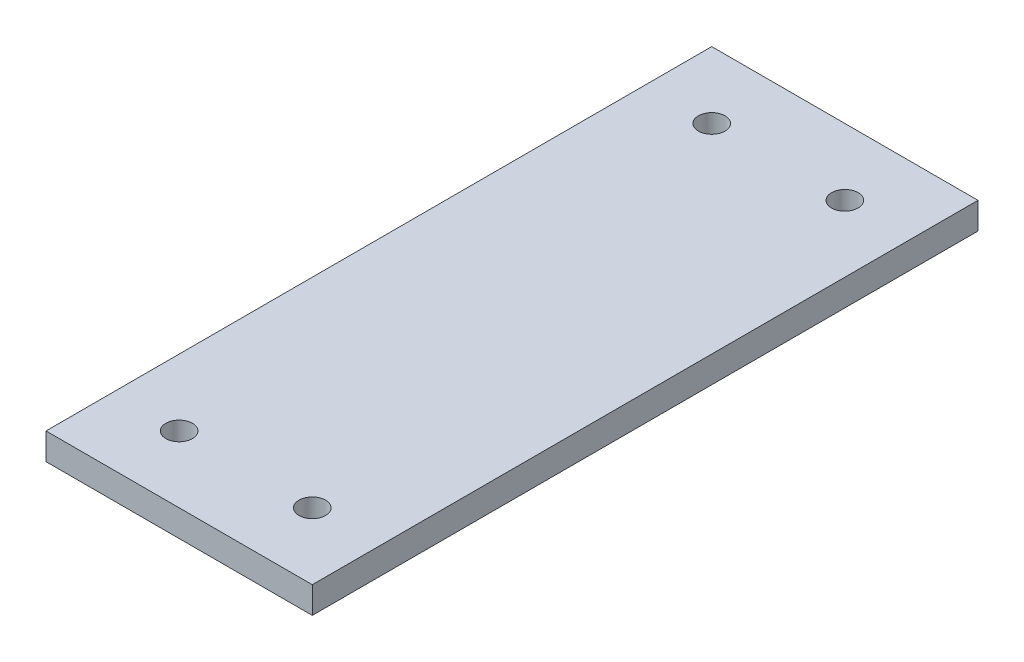
ISO-10303-21;
HEADER;
FILE_DESCRIPTION(('STEP AP214'),'2;1');
FILE_NAME('part.step','',(''),(''),'','','');
FILE_SCHEMA(('AUTOMOTIVE_DESIGN { 1 0 10303 214 1 1 1 1 }'));
ENDSEC;
DATA;
#1=APPLICATION_CONTEXT('core data for automotive mechanical design processes');
#2=APPLICATION_PROTOCOL_DEFINITION('international standard','automotive_design',2000,#1);
#3=PRODUCT_CONTEXT('',#1,'mechanical');
#4=PRODUCT('Part','Part','',(#3));
#5=PRODUCT_RELATED_PRODUCT_CATEGORY('part','',(#4));
#6=PRODUCT_DEFINITION_FORMATION('','',#4);
#7=PRODUCT_DEFINITION_CONTEXT('part definition',#1,'design');
#8=PRODUCT_DEFINITION('design','',#6,#7);
#9=PRODUCT_DEFINITION_SHAPE('','',#8);
#10=(LENGTH_UNIT() NAMED_UNIT(*) SI_UNIT(.MILLI.,.METRE.));
#11=(NAMED_UNIT(*) PLANE_ANGLE_UNIT() SI_UNIT($,.RADIAN.));
#12=(NAMED_UNIT(*) SI_UNIT($,.STERADIAN.) SOLID_ANGLE_UNIT());
#13=UNCERTAINTY_MEASURE_WITH_UNIT(LENGTH_MEASURE(1.E-05),#10,'distance_accuracy_value','');
#14=(GEOMETRIC_REPRESENTATION_CONTEXT(3) GLOBAL_UNCERTAINTY_ASSIGNED_CONTEXT((#13)) GLOBAL_UNIT_ASSIGNED_CONTEXT((#10,
#11,#12)) REPRESENTATION_CONTEXT('',''));
#15=CARTESIAN_POINT('',(0.,0.,0.));
#16=DIRECTION('',(0.,0.,1.));
#17=DIRECTION('',(1.,0.,0.));
#18=AXIS2_PLACEMENT_3D('',#15,#16,#17);
#19=CARTESIAN_POINT('',(0.,2.,0.));
#20=DIRECTION('',(1.,0.,0.));
#21=DIRECTION('',(0.,0.,-1.));
#22=AXIS2_PLACEMENT_3D('',#19,#20,#21);
#23=PLANE('',#22);
#24=DIRECTION('',(0.,0.,1.));
#25=VECTOR('',#24,1.);
#26=CARTESIAN_POINT('',(0.,0.,0.));
#27=LINE('',#26,#25);
#28=CARTESIAN_POINT('',(0.,0.,-50.));
#29=VERTEX_POINT('',#28);
#30=CARTESIAN_POINT('',(0.,0.,0.));
#31=VERTEX_POINT('',#30);
#32=EDGE_CURVE('E96',#29,#31,#27,.T.);
#33=ORIENTED_EDGE('',*,*,#32,.T.);
#34=DIRECTION('',(0.,-1.,0.));
#35=VECTOR('',#34,1.);
#36=CARTESIAN_POINT('',(0.,2.,0.));
#37=LINE('',#36,#35);
#38=CARTESIAN_POINT('',(0.,2.,0.));
#39=VERTEX_POINT('',#38);
#40=EDGE_CURVE('E11',#39,#31,#37,.T.);
#41=ORIENTED_EDGE('',*,*,#40,.F.);
#42=DIRECTION('',(0.,0.,1.));
#43=VECTOR('',#42,1.);
#44=CARTESIAN_POINT('',(0.,2.,0.));
#45=LINE('',#44,#43);
#46=CARTESIAN_POINT('',(0.,2.,-50.));
#47=VERTEX_POINT('',#46);
#48=EDGE_CURVE('E84',#47,#39,#45,.T.);
#49=ORIENTED_EDGE('',*,*,#48,.F.);
#50=DIRECTION('',(0.,-1.,0.));
#51=VECTOR('',#50,1.);
#52=CARTESIAN_POINT('',(0.,2.,-50.));
#53=LINE('',#52,#51);
#54=EDGE_CURVE('E92',#47,#29,#53,.T.);
#55=ORIENTED_EDGE('',*,*,#54,.T.);
#56=EDGE_LOOP('',(#33,#41,#49,#55));
#57=FACE_BOUND('',#56,.T.);
#58=ADVANCED_FACE('F33',(#57),#23,.F.);
#59=CARTESIAN_POINT('',(0.,2.,0.));
#60=DIRECTION('',(0.,0.,-1.));
#61=DIRECTION('',(-1.,0.,0.));
#62=AXIS2_PLACEMENT_3D('',#59,#60,#61);
#63=PLANE('',#62);
#64=DIRECTION('',(1.,0.,0.));
#65=VECTOR('',#64,1.);
#66=CARTESIAN_POINT('',(0.,0.,0.));
#67=LINE('',#66,#65);
#68=CARTESIAN_POINT('',(20.,0.,0.));
#69=VERTEX_POINT('',#68);
#70=EDGE_CURVE('E88',#31,#69,#67,.T.);
#71=ORIENTED_EDGE('',*,*,#70,.T.);
#72=DIRECTION('',(0.,-1.,0.));
#73=VECTOR('',#72,1.);
#74=CARTESIAN_POINT('',(20.,2.,0.));
#75=LINE('',#74,#73);
#76=CARTESIAN_POINT('',(20.,2.,0.));
#77=VERTEX_POINT('',#76);
#78=EDGE_CURVE('E41',#77,#69,#75,.T.);
#79=ORIENTED_EDGE('',*,*,#78,.F.);
#80=DIRECTION('',(1.,0.,0.));
#81=VECTOR('',#80,1.);
#82=CARTESIAN_POINT('',(0.,2.,0.));
#83=LINE('',#82,#81);
#84=EDGE_CURVE('E79',#39,#77,#83,.T.);
#85=ORIENTED_EDGE('',*,*,#84,.F.);
#86=ORIENTED_EDGE('',*,*,#40,.T.);
#87=EDGE_LOOP('',(#71,#79,#85,#86));
#88=FACE_BOUND('',#87,.T.);
#89=ADVANCED_FACE('F87',(#88),#63,.F.);
#90=CARTESIAN_POINT('',(20.,2.,0.));
#91=DIRECTION('',(-1.,0.,0.));
#92=DIRECTION('',(0.,0.,1.));
#93=AXIS2_PLACEMENT_3D('',#90,#91,#92);
#94=PLANE('',#93);
#95=DIRECTION('',(0.,0.,-1.));
#96=VECTOR('',#95,1.);
#97=CARTESIAN_POINT('',(20.,0.,0.));
#98=LINE('',#97,#96);
#99=CARTESIAN_POINT('',(20.,0.,-50.));
#100=VERTEX_POINT('',#99);
#101=EDGE_CURVE('E66',#69,#100,#98,.T.);
#102=ORIENTED_EDGE('',*,*,#101,.T.);
#103=DIRECTION('',(0.,-1.,0.));
#104=VECTOR('',#103,1.);
#105=CARTESIAN_POINT('',(20.,2.,-50.));
#106=LINE('',#105,#104);
#107=CARTESIAN_POINT('',(20.,2.,-50.));
#108=VERTEX_POINT('',#107);
#109=EDGE_CURVE('E89',#108,#100,#106,.T.);
#110=ORIENTED_EDGE('',*,*,#109,.F.);
#111=DIRECTION('',(0.,0.,-1.));
#112=VECTOR('',#111,1.);
#113=CARTESIAN_POINT('',(20.,2.,0.));
#114=LINE('',#113,#112);
#115=EDGE_CURVE('E82',#77,#108,#114,.T.);
#116=ORIENTED_EDGE('',*,*,#115,.F.);
#117=ORIENTED_EDGE('',*,*,#78,.T.);
#118=EDGE_LOOP('',(#102,#110,#116,#117));
#119=FACE_BOUND('',#118,.T.);
#120=ADVANCED_FACE('F90',(#119),#94,.F.);
#121=CARTESIAN_POINT('',(0.,2.,-50.));
#122=DIRECTION('',(0.,0.,1.));
#123=DIRECTION('',(1.,0.,0.));
#124=AXIS2_PLACEMENT_3D('',#121,#122,#123);
#125=PLANE('',#124);
#126=DIRECTION('',(-1.,0.,0.));
#127=VECTOR('',#126,1.);
#128=CARTESIAN_POINT('',(0.,0.,-50.));
#129=LINE('',#128,#127);
#130=EDGE_CURVE('E72',#100,#29,#129,.T.);
#131=ORIENTED_EDGE('',*,*,#130,.T.);
#132=ORIENTED_EDGE('',*,*,#54,.F.);
#133=DIRECTION('',(-1.,0.,0.));
#134=VECTOR('',#133,1.);
#135=CARTESIAN_POINT('',(0.,2.,-50.));
#136=LINE('',#135,#134);
#137=EDGE_CURVE('E49',#108,#47,#136,.T.);
#138=ORIENTED_EDGE('',*,*,#137,.F.);
#139=ORIENTED_EDGE('',*,*,#109,.T.);
#140=EDGE_LOOP('',(#131,#132,#138,#139));
#141=FACE_BOUND('',#140,.T.);
#142=ADVANCED_FACE('F104',(#141),#125,.F.);
#143=CARTESIAN_POINT('',(0.,2.,0.));
#144=DIRECTION('',(0.,-1.,0.));
#145=DIRECTION('',(0.,0.,-1.));
#146=AXIS2_PLACEMENT_3D('',#143,#144,#145);
#147=PLANE('',#146);
#148=CARTESIAN_POINT('',(15.,2.,-45.));
#149=DIRECTION('',(0.,1.,0.));
#150=DIRECTION('',(0.,0.,1.));
#151=AXIS2_PLACEMENT_3D('',#148,#149,#150);
#152=CIRCLE('',#151,1.);
#153=CARTESIAN_POINT('',(15.,2.,-44.));
#154=VERTEX_POINT('',#153);
#155=EDGE_CURVE('E128',#154,#154,#152,.T.);
#156=ORIENTED_EDGE('',*,*,#155,.F.);
#157=EDGE_LOOP('',(#156));
#158=FACE_BOUND('',#157,.T.);
#159=CARTESIAN_POINT('',(15.,2.,-5.));
#160=DIRECTION('',(0.,1.,0.));
#161=DIRECTION('',(0.,0.,1.));
#162=AXIS2_PLACEMENT_3D('',#159,#160,#161);
#163=CIRCLE('',#162,1.);
#164=CARTESIAN_POINT('',(15.,2.,-4.));
#165=VERTEX_POINT('',#164);
#166=EDGE_CURVE('E122',#165,#165,#163,.T.);
#167=ORIENTED_EDGE('',*,*,#166,.F.);
#168=EDGE_LOOP('',(#167));
#169=FACE_BOUND('',#168,.T.);
#170=CARTESIAN_POINT('',(5.,2.,-5.));
#171=DIRECTION('',(0.,1.,0.));
#172=DIRECTION('',(0.,0.,1.));
#173=AXIS2_PLACEMENT_3D('',#170,#171,#172);
#174=CIRCLE('',#173,1.);
#175=CARTESIAN_POINT('',(5.,2.,-4.));
#176=VERTEX_POINT('',#175);
#177=EDGE_CURVE('E116',#176,#176,#174,.T.);
#178=ORIENTED_EDGE('',*,*,#177,.F.);
#179=EDGE_LOOP('',(#178));
#180=FACE_BOUND('',#179,.T.);
#181=CARTESIAN_POINT('',(5.,2.,-45.));
#182=DIRECTION('',(0.,1.,0.));
#183=DIRECTION('',(0.,0.,1.));
#184=AXIS2_PLACEMENT_3D('',#181,#182,#183);
#185=CIRCLE('',#184,1.);
#186=CARTESIAN_POINT('',(5.,2.,-44.));
#187=VERTEX_POINT('',#186);
#188=EDGE_CURVE('E110',#187,#187,#185,.T.);
#189=ORIENTED_EDGE('',*,*,#188,.F.);
#190=EDGE_LOOP('',(#189));
#191=FACE_BOUND('',#190,.T.);
#192=ORIENTED_EDGE('',*,*,#48,.T.);
#193=ORIENTED_EDGE('',*,*,#84,.T.);
#194=ORIENTED_EDGE('',*,*,#115,.T.);
#195=ORIENTED_EDGE('',*,*,#137,.T.);
#196=EDGE_LOOP('',(#192,#193,#194,#195));
#197=FACE_BOUND('',#196,.T.);
#198=ADVANCED_FACE('F80',(#158,#169,#180,#191,#197),#147,.F.);
#199=CARTESIAN_POINT('',(0.,0.,0.));
#200=DIRECTION('',(0.,-1.,0.));
#201=DIRECTION('',(0.,0.,-1.));
#202=AXIS2_PLACEMENT_3D('',#199,#200,#201);
#203=PLANE('',#202);
#204=CARTESIAN_POINT('',(15.,0.,-45.));
#205=DIRECTION('',(0.,1.,0.));
#206=DIRECTION('',(0.,0.,1.));
#207=AXIS2_PLACEMENT_3D('',#204,#205,#206);
#208=CIRCLE('',#207,1.);
#209=CARTESIAN_POINT('',(15.,0.,-44.));
#210=VERTEX_POINT('',#209);
#211=EDGE_CURVE('E113',#210,#210,#208,.T.);
#212=ORIENTED_EDGE('',*,*,#211,.T.);
#213=EDGE_LOOP('',(#212));
#214=FACE_BOUND('',#213,.T.);
#215=CARTESIAN_POINT('',(15.,0.,-5.));
#216=DIRECTION('',(0.,1.,0.));
#217=DIRECTION('',(0.,0.,1.));
#218=AXIS2_PLACEMENT_3D('',#215,#216,#217);
#219=CIRCLE('',#218,1.);
#220=CARTESIAN_POINT('',(15.,0.,-4.));
#221=VERTEX_POINT('',#220);
#222=EDGE_CURVE('E125',#221,#221,#219,.T.);
#223=ORIENTED_EDGE('',*,*,#222,.T.);
#224=EDGE_LOOP('',(#223));
#225=FACE_BOUND('',#224,.T.);
#226=CARTESIAN_POINT('',(5.,0.,-5.));
#227=DIRECTION('',(0.,1.,0.));
#228=DIRECTION('',(0.,0.,1.));
#229=AXIS2_PLACEMENT_3D('',#226,#227,#228);
#230=CIRCLE('',#229,1.);
#231=CARTESIAN_POINT('',(5.,0.,-4.));
#232=VERTEX_POINT('',#231);
#233=EDGE_CURVE('E119',#232,#232,#230,.T.);
#234=ORIENTED_EDGE('',*,*,#233,.T.);
#235=EDGE_LOOP('',(#234));
#236=FACE_BOUND('',#235,.T.);
#237=CARTESIAN_POINT('',(5.,0.,-45.));
#238=DIRECTION('',(0.,1.,0.));
#239=DIRECTION('',(0.,0.,1.));
#240=AXIS2_PLACEMENT_3D('',#237,#238,#239);
#241=CIRCLE('',#240,1.);
#242=CARTESIAN_POINT('',(5.,0.,-44.));
#243=VERTEX_POINT('',#242);
#244=EDGE_CURVE('E99',#243,#243,#241,.T.);
#245=ORIENTED_EDGE('',*,*,#244,.T.);
#246=EDGE_LOOP('',(#245));
#247=FACE_BOUND('',#246,.T.);
#248=ORIENTED_EDGE('',*,*,#32,.F.);
#249=ORIENTED_EDGE('',*,*,#130,.F.);
#250=ORIENTED_EDGE('',*,*,#101,.F.);
#251=ORIENTED_EDGE('',*,*,#70,.F.);
#252=EDGE_LOOP('',(#248,#249,#250,#251));
#253=FACE_BOUND('',#252,.T.);
#254=ADVANCED_FACE('F107',(#214,#225,#236,#247,#253),#203,.T.);
#255=CARTESIAN_POINT('',(5.,0.,-45.));
#256=DIRECTION('',(0.,1.,0.));
#257=DIRECTION('',(0.,0.,1.));
#258=AXIS2_PLACEMENT_3D('',#255,#256,#257);
#259=CYLINDRICAL_SURFACE('',#258,1.);
#260=ORIENTED_EDGE('',*,*,#244,.F.);
#261=EDGE_LOOP('',(#260));
#262=FACE_BOUND('',#261,.T.);
#263=ORIENTED_EDGE('',*,*,#188,.T.);
#264=EDGE_LOOP('',(#263));
#265=FACE_BOUND('',#264,.T.);
#266=ADVANCED_FACE('F152',(#262,#265),#259,.F.);
#267=CARTESIAN_POINT('',(5.,0.,-5.));
#268=DIRECTION('',(0.,1.,0.));
#269=DIRECTION('',(0.,0.,1.));
#270=AXIS2_PLACEMENT_3D('',#267,#268,#269);
#271=CYLINDRICAL_SURFACE('',#270,1.);
#272=ORIENTED_EDGE('',*,*,#233,.F.);
#273=EDGE_LOOP('',(#272));
#274=FACE_BOUND('',#273,.T.);
#275=ORIENTED_EDGE('',*,*,#177,.T.);
#276=EDGE_LOOP('',(#275));
#277=FACE_BOUND('',#276,.T.);
#278=ADVANCED_FACE('F154',(#274,#277),#271,.F.);
#279=CARTESIAN_POINT('',(15.,0.,-5.));
#280=DIRECTION('',(0.,1.,0.));
#281=DIRECTION('',(0.,0.,1.));
#282=AXIS2_PLACEMENT_3D('',#279,#280,#281);
#283=CYLINDRICAL_SURFACE('',#282,1.);
#284=ORIENTED_EDGE('',*,*,#222,.F.);
#285=EDGE_LOOP('',(#284));
#286=FACE_BOUND('',#285,.T.);
#287=ORIENTED_EDGE('',*,*,#166,.T.);
#288=EDGE_LOOP('',(#287));
#289=FACE_BOUND('',#288,.T.);
#290=ADVANCED_FACE('F139',(#286,#289),#283,.F.);
#291=CARTESIAN_POINT('',(15.,0.,-45.));
#292=DIRECTION('',(0.,1.,0.));
#293=DIRECTION('',(0.,0.,1.));
#294=AXIS2_PLACEMENT_3D('',#291,#292,#293);
#295=CYLINDRICAL_SURFACE('',#294,1.);
#296=ORIENTED_EDGE('',*,*,#211,.F.);
#297=EDGE_LOOP('',(#296));
#298=FACE_BOUND('',#297,.T.);
#299=ORIENTED_EDGE('',*,*,#155,.T.);
#300=EDGE_LOOP('',(#299));
#301=FACE_BOUND('',#300,.T.);
#302=ADVANCED_FACE('F136',(#298,#301),#295,.F.);
#303=CLOSED_SHELL('',(#58,#89,#120,#142,#198,#254,#266,#278,#290,#302));
#304=MANIFOLD_SOLID_BREP('B2',#303);
#305=ADVANCED_BREP_SHAPE_REPRESENTATION('',(#18,#304),#14);
#306=SHAPE_DEFINITION_REPRESENTATION(#9,#305);
ENDSEC;
END-ISO-10303-21;
